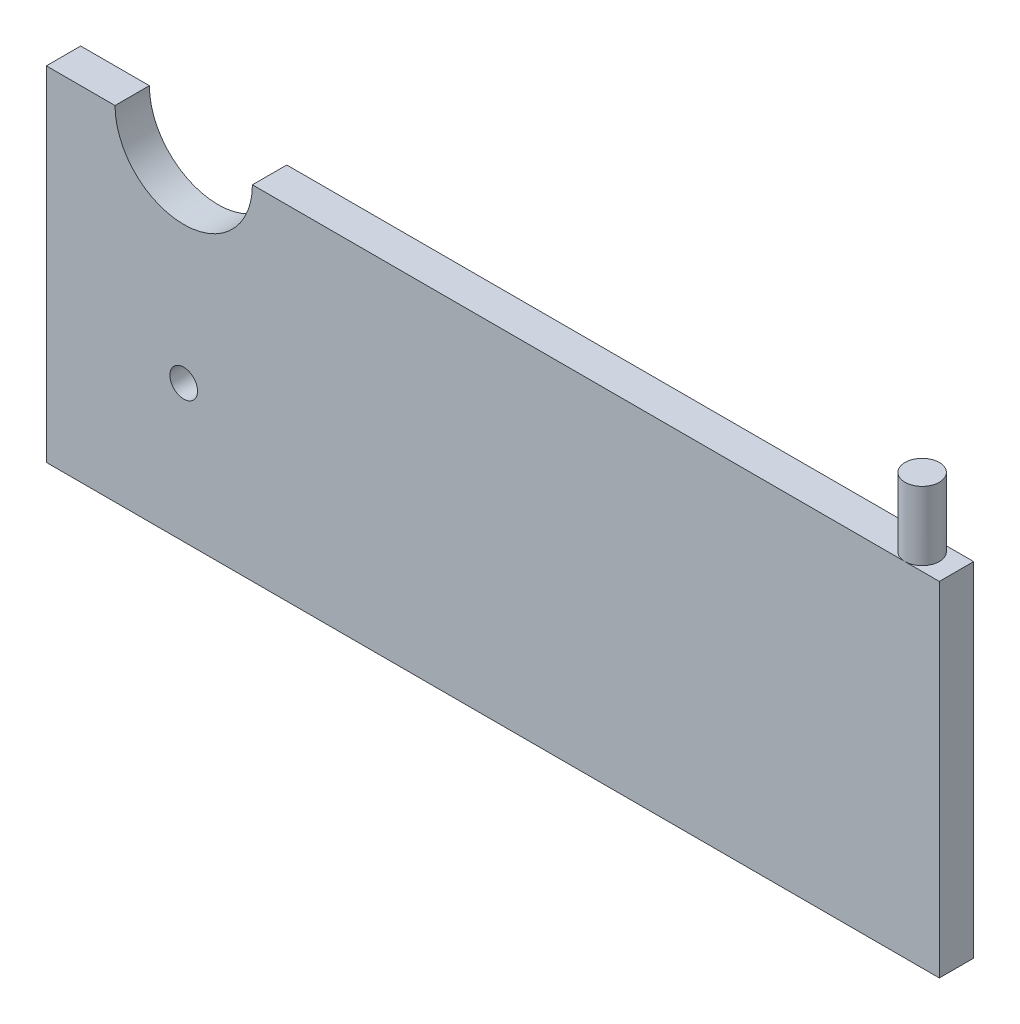
ISO-10303-21;
HEADER;
FILE_DESCRIPTION(('STEP AP214'),'2;1');
FILE_NAME('part.step','',(''),(''),'','','');
FILE_SCHEMA(('AUTOMOTIVE_DESIGN { 1 0 10303 214 1 1 1 1 }'));
ENDSEC;
DATA;
#1=APPLICATION_CONTEXT('core data for automotive mechanical design processes');
#2=APPLICATION_PROTOCOL_DEFINITION('international standard','automotive_design',2000,#1);
#3=PRODUCT_CONTEXT('',#1,'mechanical');
#4=PRODUCT('Part','Part','',(#3));
#5=PRODUCT_RELATED_PRODUCT_CATEGORY('part','',(#4));
#6=PRODUCT_DEFINITION_FORMATION('','',#4);
#7=PRODUCT_DEFINITION_CONTEXT('part definition',#1,'design');
#8=PRODUCT_DEFINITION('design','',#6,#7);
#9=PRODUCT_DEFINITION_SHAPE('','',#8);
#10=(LENGTH_UNIT() NAMED_UNIT(*) SI_UNIT(.MILLI.,.METRE.));
#11=(NAMED_UNIT(*) PLANE_ANGLE_UNIT() SI_UNIT($,.RADIAN.));
#12=(NAMED_UNIT(*) SI_UNIT($,.STERADIAN.) SOLID_ANGLE_UNIT());
#13=UNCERTAINTY_MEASURE_WITH_UNIT(LENGTH_MEASURE(1.E-05),#10,'distance_accuracy_value','');
#14=(GEOMETRIC_REPRESENTATION_CONTEXT(3) GLOBAL_UNCERTAINTY_ASSIGNED_CONTEXT((#13)) GLOBAL_UNIT_ASSIGNED_CONTEXT((#10,
#11,#12)) REPRESENTATION_CONTEXT('',''));
#15=CARTESIAN_POINT('',(0.,0.,0.));
#16=DIRECTION('',(0.,0.,1.));
#17=DIRECTION('',(1.,0.,0.));
#18=AXIS2_PLACEMENT_3D('',#15,#16,#17);
#19=CARTESIAN_POINT('',(12.7,25.4,3.175));
#20=DIRECTION('',(0.,-1.,0.));
#21=DIRECTION('',(1.,0.,0.));
#22=AXIS2_PLACEMENT_3D('',#19,#20,#21);
#23=PLANE('',#22);
#24=CARTESIAN_POINT('',(133.35,25.4,0.));
#25=DIRECTION('',(0.,1.,0.));
#26=DIRECTION('',(-1.,0.,0.));
#27=AXIS2_PLACEMENT_3D('',#24,#25,#26);
#28=CIRCLE('',#27,3.175);
#29=CARTESIAN_POINT('',(133.35,25.4,-3.175));
#30=VERTEX_POINT('',#29);
#31=CARTESIAN_POINT('',(133.35,25.4,3.175));
#32=VERTEX_POINT('',#31);
#33=EDGE_CURVE('E217',#30,#32,#28,.T.);
#34=ORIENTED_EDGE('',*,*,#33,.F.);
#35=DIRECTION('',(-1.,0.,0.));
#36=VECTOR('',#35,1.);
#37=CARTESIAN_POINT('',(12.7,25.4,-3.175));
#38=LINE('',#37,#36);
#39=CARTESIAN_POINT('',(12.7,25.4,-3.175));
#40=VERTEX_POINT('',#39);
#41=EDGE_CURVE('E127',#30,#40,#38,.T.);
#42=ORIENTED_EDGE('',*,*,#41,.T.);
#43=DIRECTION('',(0.,0.,-1.));
#44=VECTOR('',#43,1.);
#45=CARTESIAN_POINT('',(12.7,25.4,3.175));
#46=LINE('',#45,#44);
#47=CARTESIAN_POINT('',(12.7,25.4,3.175));
#48=VERTEX_POINT('',#47);
#49=EDGE_CURVE('E125',#48,#40,#46,.T.);
#50=ORIENTED_EDGE('',*,*,#49,.F.);
#51=DIRECTION('',(-1.,0.,0.));
#52=VECTOR('',#51,1.);
#53=CARTESIAN_POINT('',(12.7,25.4,3.175));
#54=LINE('',#53,#52);
#55=EDGE_CURVE('E111',#32,#48,#54,.T.);
#56=ORIENTED_EDGE('',*,*,#55,.F.);
#57=EDGE_LOOP('',(#34,#42,#50,#56));
#58=FACE_BOUND('',#57,.T.);
#59=ADVANCED_FACE('F43',(#58),#23,.F.);
#60=CARTESIAN_POINT('',(-25.4,25.4,3.175));
#61=DIRECTION('',(1.,0.,0.));
#62=DIRECTION('',(0.,1.,0.));
#63=AXIS2_PLACEMENT_3D('',#60,#61,#62);
#64=PLANE('',#63);
#65=DIRECTION('',(0.,-1.,0.));
#66=VECTOR('',#65,1.);
#67=CARTESIAN_POINT('',(-25.4,25.4,-3.175));
#68=LINE('',#67,#66);
#69=CARTESIAN_POINT('',(-25.4,25.4,-3.175));
#70=VERTEX_POINT('',#69);
#71=CARTESIAN_POINT('',(-25.4,-38.1,-3.175));
#72=VERTEX_POINT('',#71);
#73=EDGE_CURVE('E143',#70,#72,#68,.T.);
#74=ORIENTED_EDGE('',*,*,#73,.T.);
#75=DIRECTION('',(0.,0.,-1.));
#76=VECTOR('',#75,1.);
#77=CARTESIAN_POINT('',(-25.4,-38.1,3.175));
#78=LINE('',#77,#76);
#79=CARTESIAN_POINT('',(-25.4,-38.1,3.175));
#80=VERTEX_POINT('',#79);
#81=EDGE_CURVE('E11',#80,#72,#78,.T.);
#82=ORIENTED_EDGE('',*,*,#81,.F.);
#83=DIRECTION('',(0.,-1.,0.));
#84=VECTOR('',#83,1.);
#85=CARTESIAN_POINT('',(-25.4,25.4,3.175));
#86=LINE('',#85,#84);
#87=CARTESIAN_POINT('',(-25.4,25.4,3.175));
#88=VERTEX_POINT('',#87);
#89=EDGE_CURVE('E162',#88,#80,#86,.T.);
#90=ORIENTED_EDGE('',*,*,#89,.F.);
#91=DIRECTION('',(0.,0.,-1.));
#92=VECTOR('',#91,1.);
#93=CARTESIAN_POINT('',(-25.4,25.4,3.175));
#94=LINE('',#93,#92);
#95=EDGE_CURVE('E139',#88,#70,#94,.T.);
#96=ORIENTED_EDGE('',*,*,#95,.T.);
#97=EDGE_LOOP('',(#74,#82,#90,#96));
#98=FACE_BOUND('',#97,.T.);
#99=ADVANCED_FACE('F45',(#98),#64,.F.);
#100=CARTESIAN_POINT('',(-25.4,-38.1,3.175));
#101=DIRECTION('',(0.,1.,0.));
#102=DIRECTION('',(-1.,0.,0.));
#103=AXIS2_PLACEMENT_3D('',#100,#101,#102);
#104=PLANE('',#103);
#105=DIRECTION('',(1.,0.,0.));
#106=VECTOR('',#105,1.);
#107=CARTESIAN_POINT('',(-25.4,-38.1,-3.175));
#108=LINE('',#107,#106);
#109=CARTESIAN_POINT('',(139.7,-38.1,-3.175));
#110=VERTEX_POINT('',#109);
#111=EDGE_CURVE('E147',#72,#110,#108,.T.);
#112=ORIENTED_EDGE('',*,*,#111,.T.);
#113=DIRECTION('',(0.,0.,-1.));
#114=VECTOR('',#113,1.);
#115=CARTESIAN_POINT('',(139.7,-38.1,3.175));
#116=LINE('',#115,#114);
#117=CARTESIAN_POINT('',(139.7,-38.1,3.175));
#118=VERTEX_POINT('',#117);
#119=EDGE_CURVE('E52',#118,#110,#116,.T.);
#120=ORIENTED_EDGE('',*,*,#119,.F.);
#121=DIRECTION('',(1.,0.,0.));
#122=VECTOR('',#121,1.);
#123=CARTESIAN_POINT('',(-25.4,-38.1,3.175));
#124=LINE('',#123,#122);
#125=EDGE_CURVE('E103',#80,#118,#124,.T.);
#126=ORIENTED_EDGE('',*,*,#125,.F.);
#127=ORIENTED_EDGE('',*,*,#81,.T.);
#128=EDGE_LOOP('',(#112,#120,#126,#127));
#129=FACE_BOUND('',#128,.T.);
#130=ADVANCED_FACE('F189',(#129),#104,.F.);
#131=CARTESIAN_POINT('',(139.7,25.4,3.175));
#132=DIRECTION('',(-1.,0.,0.));
#133=DIRECTION('',(0.,0.,1.));
#134=AXIS2_PLACEMENT_3D('',#131,#132,#133);
#135=PLANE('',#134);
#136=DIRECTION('',(0.,1.,0.));
#137=VECTOR('',#136,1.);
#138=CARTESIAN_POINT('',(139.7,25.4,-3.175));
#139=LINE('',#138,#137);
#140=CARTESIAN_POINT('',(139.7,25.4,-3.175));
#141=VERTEX_POINT('',#140);
#142=EDGE_CURVE('E151',#110,#141,#139,.T.);
#143=ORIENTED_EDGE('',*,*,#142,.T.);
#144=DIRECTION('',(0.,0.,-1.));
#145=VECTOR('',#144,1.);
#146=CARTESIAN_POINT('',(139.7,25.4,3.175));
#147=LINE('',#146,#145);
#148=CARTESIAN_POINT('',(139.7,25.4,3.175));
#149=VERTEX_POINT('',#148);
#150=EDGE_CURVE('E131',#149,#141,#147,.T.);
#151=ORIENTED_EDGE('',*,*,#150,.F.);
#152=DIRECTION('',(0.,1.,0.));
#153=VECTOR('',#152,1.);
#154=CARTESIAN_POINT('',(139.7,25.4,3.175));
#155=LINE('',#154,#153);
#156=EDGE_CURVE('E122',#118,#149,#155,.T.);
#157=ORIENTED_EDGE('',*,*,#156,.F.);
#158=ORIENTED_EDGE('',*,*,#119,.T.);
#159=EDGE_LOOP('',(#143,#151,#157,#158));
#160=FACE_BOUND('',#159,.T.);
#161=ADVANCED_FACE('F174',(#160),#135,.F.);
#162=EDGE_CURVE('E59',#32,#30,#28,.T.);
#163=ORIENTED_EDGE('',*,*,#162,.F.);
#164=EDGE_CURVE('E117',#149,#32,#54,.T.);
#165=ORIENTED_EDGE('',*,*,#164,.F.);
#166=ORIENTED_EDGE('',*,*,#150,.T.);
#167=EDGE_CURVE('E154',#141,#30,#38,.T.);
#168=ORIENTED_EDGE('',*,*,#167,.T.);
#169=EDGE_LOOP('',(#163,#165,#166,#168));
#170=FACE_BOUND('',#169,.T.);
#171=ADVANCED_FACE('F180',(#170),#23,.F.);
#172=CARTESIAN_POINT('',(0.,25.4,3.175));
#173=DIRECTION('',(0.,0.,-1.));
#174=DIRECTION('',(-1.,0.,0.));
#175=AXIS2_PLACEMENT_3D('',#172,#173,#174);
#176=CYLINDRICAL_SURFACE('',#175,12.7);
#177=CARTESIAN_POINT('',(0.,25.4,-3.175));
#178=DIRECTION('',(0.,0.,-1.));
#179=DIRECTION('',(1.,0.,0.));
#180=AXIS2_PLACEMENT_3D('',#177,#178,#179);
#181=CIRCLE('',#180,12.7);
#182=CARTESIAN_POINT('',(-12.7,25.4,-3.175));
#183=VERTEX_POINT('',#182);
#184=EDGE_CURVE('E157',#40,#183,#181,.T.);
#185=ORIENTED_EDGE('',*,*,#184,.T.);
#186=DIRECTION('',(0.,0.,-1.));
#187=VECTOR('',#186,1.);
#188=CARTESIAN_POINT('',(-12.7,25.4,3.175));
#189=LINE('',#188,#187);
#190=CARTESIAN_POINT('',(-12.7,25.4,3.175));
#191=VERTEX_POINT('',#190);
#192=EDGE_CURVE('E132',#191,#183,#189,.T.);
#193=ORIENTED_EDGE('',*,*,#192,.F.);
#194=CARTESIAN_POINT('',(0.,25.4,3.175));
#195=DIRECTION('',(0.,0.,-1.));
#196=DIRECTION('',(1.,0.,0.));
#197=AXIS2_PLACEMENT_3D('',#194,#195,#196);
#198=CIRCLE('',#197,12.7);
#199=EDGE_CURVE('E115',#48,#191,#198,.T.);
#200=ORIENTED_EDGE('',*,*,#199,.F.);
#201=ORIENTED_EDGE('',*,*,#49,.T.);
#202=EDGE_LOOP('',(#185,#193,#200,#201));
#203=FACE_BOUND('',#202,.T.);
#204=ADVANCED_FACE('F134',(#203),#176,.F.);
#205=CARTESIAN_POINT('',(-25.4,25.4,3.175));
#206=DIRECTION('',(0.,-1.,0.));
#207=DIRECTION('',(1.,0.,0.));
#208=AXIS2_PLACEMENT_3D('',#205,#206,#207);
#209=PLANE('',#208);
#210=DIRECTION('',(-1.,0.,0.));
#211=VECTOR('',#210,1.);
#212=CARTESIAN_POINT('',(-25.4,25.4,-3.175));
#213=LINE('',#212,#211);
#214=EDGE_CURVE('E95',#183,#70,#213,.T.);
#215=ORIENTED_EDGE('',*,*,#214,.T.);
#216=ORIENTED_EDGE('',*,*,#95,.F.);
#217=DIRECTION('',(-1.,0.,0.));
#218=VECTOR('',#217,1.);
#219=CARTESIAN_POINT('',(-25.4,25.4,3.175));
#220=LINE('',#219,#218);
#221=EDGE_CURVE('E68',#191,#88,#220,.T.);
#222=ORIENTED_EDGE('',*,*,#221,.F.);
#223=ORIENTED_EDGE('',*,*,#192,.T.);
#224=EDGE_LOOP('',(#215,#216,#222,#223));
#225=FACE_BOUND('',#224,.T.);
#226=ADVANCED_FACE('F187',(#225),#209,.F.);
#227=CARTESIAN_POINT('',(0.,25.4,3.175));
#228=DIRECTION('',(0.,0.,1.));
#229=DIRECTION('',(1.,0.,0.));
#230=AXIS2_PLACEMENT_3D('',#227,#228,#229);
#231=PLANE('',#230);
#232=CARTESIAN_POINT('',(0.,-12.7,3.175));
#233=DIRECTION('',(0.,0.,1.));
#234=DIRECTION('',(1.,0.,0.));
#235=AXIS2_PLACEMENT_3D('',#232,#233,#234);
#236=CIRCLE('',#235,2.5527);
#237=CARTESIAN_POINT('',(2.5527,-12.7,3.175));
#238=VERTEX_POINT('',#237);
#239=EDGE_CURVE('E210',#238,#238,#236,.T.);
#240=ORIENTED_EDGE('',*,*,#239,.F.);
#241=EDGE_LOOP('',(#240));
#242=FACE_BOUND('',#241,.T.);
#243=ORIENTED_EDGE('',*,*,#89,.T.);
#244=ORIENTED_EDGE('',*,*,#125,.T.);
#245=ORIENTED_EDGE('',*,*,#156,.T.);
#246=ORIENTED_EDGE('',*,*,#164,.T.);
#247=ORIENTED_EDGE('',*,*,#55,.T.);
#248=ORIENTED_EDGE('',*,*,#199,.T.);
#249=ORIENTED_EDGE('',*,*,#221,.T.);
#250=EDGE_LOOP('',(#243,#244,#245,#246,#247,#248,#249));
#251=FACE_BOUND('',#250,.T.);
#252=ADVANCED_FACE('F113',(#242,#251),#231,.T.);
#253=CARTESIAN_POINT('',(0.,25.4,-3.175));
#254=DIRECTION('',(0.,0.,1.));
#255=DIRECTION('',(1.,0.,0.));
#256=AXIS2_PLACEMENT_3D('',#253,#254,#255);
#257=PLANE('',#256);
#258=CARTESIAN_POINT('',(0.,-12.7,-3.175));
#259=DIRECTION('',(0.,0.,1.));
#260=DIRECTION('',(1.,0.,0.));
#261=AXIS2_PLACEMENT_3D('',#258,#259,#260);
#262=CIRCLE('',#261,2.5527);
#263=CARTESIAN_POINT('',(2.5527,-12.7,-3.175));
#264=VERTEX_POINT('',#263);
#265=EDGE_CURVE('E148',#264,#264,#262,.T.);
#266=ORIENTED_EDGE('',*,*,#265,.T.);
#267=EDGE_LOOP('',(#266));
#268=FACE_BOUND('',#267,.T.);
#269=ORIENTED_EDGE('',*,*,#73,.F.);
#270=ORIENTED_EDGE('',*,*,#214,.F.);
#271=ORIENTED_EDGE('',*,*,#184,.F.);
#272=ORIENTED_EDGE('',*,*,#41,.F.);
#273=ORIENTED_EDGE('',*,*,#167,.F.);
#274=ORIENTED_EDGE('',*,*,#142,.F.);
#275=ORIENTED_EDGE('',*,*,#111,.F.);
#276=EDGE_LOOP('',(#269,#270,#271,#272,#273,#274,#275));
#277=FACE_BOUND('',#276,.T.);
#278=ADVANCED_FACE('F179',(#268,#277),#257,.F.);
#279=CARTESIAN_POINT('',(0.,-12.7,3.175));
#280=DIRECTION('',(0.,0.,1.));
#281=DIRECTION('',(1.,0.,0.));
#282=AXIS2_PLACEMENT_3D('',#279,#280,#281);
#283=CYLINDRICAL_SURFACE('',#282,2.5527);
#284=ORIENTED_EDGE('',*,*,#265,.F.);
#285=EDGE_LOOP('',(#284));
#286=FACE_BOUND('',#285,.T.);
#287=ORIENTED_EDGE('',*,*,#239,.T.);
#288=EDGE_LOOP('',(#287));
#289=FACE_BOUND('',#288,.T.);
#290=ADVANCED_FACE('F227',(#286,#289),#283,.F.);
#291=CARTESIAN_POINT('',(133.35,38.1,0.));
#292=DIRECTION('',(0.,-1.,0.));
#293=DIRECTION('',(1.,0.,0.));
#294=AXIS2_PLACEMENT_3D('',#291,#292,#293);
#295=CYLINDRICAL_SURFACE('',#294,3.175);
#296=CARTESIAN_POINT('',(133.35,38.1,0.));
#297=DIRECTION('',(0.,1.,0.));
#298=DIRECTION('',(-1.,0.,0.));
#299=AXIS2_PLACEMENT_3D('',#296,#297,#298);
#300=CIRCLE('',#299,3.175);
#301=CARTESIAN_POINT('',(130.175,38.1,0.));
#302=VERTEX_POINT('',#301);
#303=EDGE_CURVE('E214',#302,#302,#300,.T.);
#304=ORIENTED_EDGE('',*,*,#303,.F.);
#305=EDGE_LOOP('',(#304));
#306=FACE_BOUND('',#305,.T.);
#307=ORIENTED_EDGE('',*,*,#162,.T.);
#308=ORIENTED_EDGE('',*,*,#33,.T.);
#309=EDGE_LOOP('',(#307,#308));
#310=FACE_BOUND('',#309,.T.);
#311=ADVANCED_FACE('F224',(#306,#310),#295,.T.);
#312=CARTESIAN_POINT('',(133.35,38.1,0.));
#313=DIRECTION('',(0.,1.,0.));
#314=DIRECTION('',(-1.,0.,0.));
#315=AXIS2_PLACEMENT_3D('',#312,#313,#314);
#316=PLANE('',#315);
#317=ORIENTED_EDGE('',*,*,#303,.T.);
#318=EDGE_LOOP('',(#317));
#319=FACE_BOUND('',#318,.T.);
#320=ADVANCED_FACE('F222',(#319),#316,.T.);
#321=CLOSED_SHELL('',(#59,#99,#130,#161,#171,#204,#226,#252,#278,#290,#311,#320));
#322=MANIFOLD_SOLID_BREP('B2',#321);
#323=ADVANCED_BREP_SHAPE_REPRESENTATION('',(#18,#322),#14);
#324=SHAPE_DEFINITION_REPRESENTATION(#9,#323);
ENDSEC;
END-ISO-10303-21;
